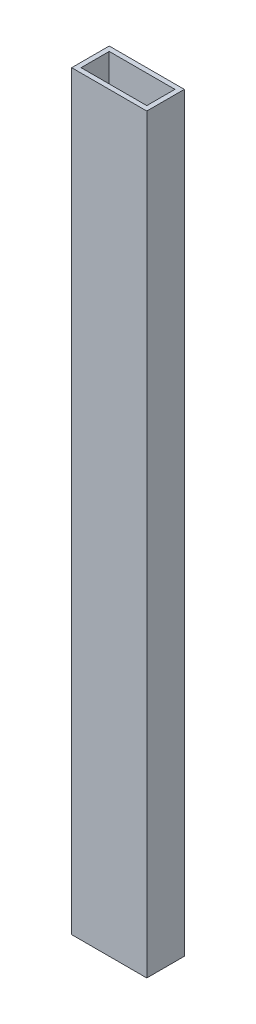
ISO-10303-21;
HEADER;
FILE_DESCRIPTION(('STEP AP214'),'2;1');
FILE_NAME('part.step','',(''),(''),'','','');
FILE_SCHEMA(('AUTOMOTIVE_DESIGN { 1 0 10303 214 1 1 1 1 }'));
ENDSEC;
DATA;
#1=APPLICATION_CONTEXT('core data for automotive mechanical design processes');
#2=APPLICATION_PROTOCOL_DEFINITION('international standard','automotive_design',2000,#1);
#3=PRODUCT_CONTEXT('',#1,'mechanical');
#4=PRODUCT('Part','Part','',(#3));
#5=PRODUCT_RELATED_PRODUCT_CATEGORY('part','',(#4));
#6=PRODUCT_DEFINITION_FORMATION('','',#4);
#7=PRODUCT_DEFINITION_CONTEXT('part definition',#1,'design');
#8=PRODUCT_DEFINITION('design','',#6,#7);
#9=PRODUCT_DEFINITION_SHAPE('','',#8);
#10=(LENGTH_UNIT() NAMED_UNIT(*) SI_UNIT(.MILLI.,.METRE.));
#11=(NAMED_UNIT(*) PLANE_ANGLE_UNIT() SI_UNIT($,.RADIAN.));
#12=(NAMED_UNIT(*) SI_UNIT($,.STERADIAN.) SOLID_ANGLE_UNIT());
#13=UNCERTAINTY_MEASURE_WITH_UNIT(LENGTH_MEASURE(1.E-05),#10,'distance_accuracy_value','');
#14=(GEOMETRIC_REPRESENTATION_CONTEXT(3) GLOBAL_UNCERTAINTY_ASSIGNED_CONTEXT((#13)) GLOBAL_UNIT_ASSIGNED_CONTEXT((#10,
#11,#12)) REPRESENTATION_CONTEXT('',''));
#15=CARTESIAN_POINT('',(0.,0.,0.));
#16=DIRECTION('',(0.,0.,1.));
#17=DIRECTION('',(1.,0.,0.));
#18=AXIS2_PLACEMENT_3D('',#15,#16,#17);
#19=CARTESIAN_POINT('',(0.,254.,0.));
#20=DIRECTION('',(0.,1.,0.));
#21=DIRECTION('',(0.,0.,1.));
#22=AXIS2_PLACEMENT_3D('',#19,#20,#21);
#23=PLANE('',#22);
#24=DIRECTION('',(0.,0.,1.));
#25=VECTOR('',#24,1.);
#26=CARTESIAN_POINT('',(-25.4,254.,12.7));
#27=LINE('',#26,#25);
#28=CARTESIAN_POINT('',(-25.4,254.,-12.7));
#29=VERTEX_POINT('',#28);
#30=CARTESIAN_POINT('',(-25.4,254.,12.7));
#31=VERTEX_POINT('',#30);
#32=EDGE_CURVE('E159',#29,#31,#27,.T.);
#33=ORIENTED_EDGE('',*,*,#32,.T.);
#34=DIRECTION('',(1.,0.,0.));
#35=VECTOR('',#34,1.);
#36=CARTESIAN_POINT('',(25.4,254.,12.7));
#37=LINE('',#36,#35);
#38=CARTESIAN_POINT('',(25.4,254.,12.7));
#39=VERTEX_POINT('',#38);
#40=EDGE_CURVE('E163',#31,#39,#37,.T.);
#41=ORIENTED_EDGE('',*,*,#40,.T.);
#42=DIRECTION('',(0.,0.,-1.));
#43=VECTOR('',#42,1.);
#44=CARTESIAN_POINT('',(25.4,254.,12.7));
#45=LINE('',#44,#43);
#46=CARTESIAN_POINT('',(25.4,254.,-12.7));
#47=VERTEX_POINT('',#46);
#48=EDGE_CURVE('E167',#39,#47,#45,.T.);
#49=ORIENTED_EDGE('',*,*,#48,.T.);
#50=DIRECTION('',(-1.,0.,0.));
#51=VECTOR('',#50,1.);
#52=CARTESIAN_POINT('',(25.4,254.,-12.7));
#53=LINE('',#52,#51);
#54=EDGE_CURVE('E170',#47,#29,#53,.T.);
#55=ORIENTED_EDGE('',*,*,#54,.T.);
#56=EDGE_LOOP('',(#33,#41,#49,#55));
#57=FACE_BOUND('',#56,.T.);
#58=DIRECTION('',(-1.,0.,0.));
#59=VECTOR('',#58,1.);
#60=CARTESIAN_POINT('',(22.225,254.,-9.525));
#61=LINE('',#60,#59);
#62=CARTESIAN_POINT('',(22.225,254.,-9.525));
#63=VERTEX_POINT('',#62);
#64=CARTESIAN_POINT('',(-22.225,254.,-9.525));
#65=VERTEX_POINT('',#64);
#66=EDGE_CURVE('E120',#63,#65,#61,.T.);
#67=ORIENTED_EDGE('',*,*,#66,.F.);
#68=DIRECTION('',(0.,0.,-1.));
#69=VECTOR('',#68,1.);
#70=CARTESIAN_POINT('',(22.225,254.,9.525));
#71=LINE('',#70,#69);
#72=CARTESIAN_POINT('',(22.225,254.,9.525));
#73=VERTEX_POINT('',#72);
#74=EDGE_CURVE('E111',#73,#63,#71,.T.);
#75=ORIENTED_EDGE('',*,*,#74,.F.);
#76=DIRECTION('',(1.,0.,0.));
#77=VECTOR('',#76,1.);
#78=CARTESIAN_POINT('',(22.225,254.,9.525));
#79=LINE('',#78,#77);
#80=CARTESIAN_POINT('',(-22.225,254.,9.525));
#81=VERTEX_POINT('',#80);
#82=EDGE_CURVE('E137',#81,#73,#79,.T.);
#83=ORIENTED_EDGE('',*,*,#82,.F.);
#84=DIRECTION('',(0.,0.,1.));
#85=VECTOR('',#84,1.);
#86=CARTESIAN_POINT('',(-22.225,254.,9.525));
#87=LINE('',#86,#85);
#88=EDGE_CURVE('E133',#65,#81,#87,.T.);
#89=ORIENTED_EDGE('',*,*,#88,.F.);
#90=EDGE_LOOP('',(#67,#75,#83,#89));
#91=FACE_BOUND('',#90,.T.);
#92=ADVANCED_FACE('F45',(#57,#91),#23,.T.);
#93=CARTESIAN_POINT('',(0.,-254.,0.));
#94=DIRECTION('',(0.,1.,0.));
#95=DIRECTION('',(0.,0.,1.));
#96=AXIS2_PLACEMENT_3D('',#93,#94,#95);
#97=PLANE('',#96);
#98=DIRECTION('',(0.,0.,1.));
#99=VECTOR('',#98,1.);
#100=CARTESIAN_POINT('',(-25.4,-254.,12.7));
#101=LINE('',#100,#99);
#102=CARTESIAN_POINT('',(-25.4,-254.,-12.7));
#103=VERTEX_POINT('',#102);
#104=CARTESIAN_POINT('',(-25.4,-254.,12.7));
#105=VERTEX_POINT('',#104);
#106=EDGE_CURVE('E129',#103,#105,#101,.T.);
#107=ORIENTED_EDGE('',*,*,#106,.F.);
#108=DIRECTION('',(-1.,0.,0.));
#109=VECTOR('',#108,1.);
#110=CARTESIAN_POINT('',(25.4,-254.,-12.7));
#111=LINE('',#110,#109);
#112=CARTESIAN_POINT('',(25.4,-254.,-12.7));
#113=VERTEX_POINT('',#112);
#114=EDGE_CURVE('E164',#113,#103,#111,.T.);
#115=ORIENTED_EDGE('',*,*,#114,.F.);
#116=DIRECTION('',(0.,0.,-1.));
#117=VECTOR('',#116,1.);
#118=CARTESIAN_POINT('',(25.4,-254.,12.7));
#119=LINE('',#118,#117);
#120=CARTESIAN_POINT('',(25.4,-254.,12.7));
#121=VERTEX_POINT('',#120);
#122=EDGE_CURVE('E180',#121,#113,#119,.T.);
#123=ORIENTED_EDGE('',*,*,#122,.F.);
#124=DIRECTION('',(1.,0.,0.));
#125=VECTOR('',#124,1.);
#126=CARTESIAN_POINT('',(25.4,-254.,12.7));
#127=LINE('',#126,#125);
#128=EDGE_CURVE('E177',#105,#121,#127,.T.);
#129=ORIENTED_EDGE('',*,*,#128,.F.);
#130=EDGE_LOOP('',(#107,#115,#123,#129));
#131=FACE_BOUND('',#130,.T.);
#132=DIRECTION('',(0.,0.,-1.));
#133=VECTOR('',#132,1.);
#134=CARTESIAN_POINT('',(22.225,-254.,9.525));
#135=LINE('',#134,#133);
#136=CARTESIAN_POINT('',(22.225,-254.,9.525));
#137=VERTEX_POINT('',#136);
#138=CARTESIAN_POINT('',(22.225,-254.,-9.525));
#139=VERTEX_POINT('',#138);
#140=EDGE_CURVE('E69',#137,#139,#135,.T.);
#141=ORIENTED_EDGE('',*,*,#140,.T.);
#142=DIRECTION('',(-1.,0.,0.));
#143=VECTOR('',#142,1.);
#144=CARTESIAN_POINT('',(22.225,-254.,-9.525));
#145=LINE('',#144,#143);
#146=CARTESIAN_POINT('',(-22.225,-254.,-9.525));
#147=VERTEX_POINT('',#146);
#148=EDGE_CURVE('E127',#139,#147,#145,.T.);
#149=ORIENTED_EDGE('',*,*,#148,.T.);
#150=DIRECTION('',(0.,0.,1.));
#151=VECTOR('',#150,1.);
#152=CARTESIAN_POINT('',(-22.225,-254.,9.525));
#153=LINE('',#152,#151);
#154=CARTESIAN_POINT('',(-22.225,-254.,9.525));
#155=VERTEX_POINT('',#154);
#156=EDGE_CURVE('E146',#147,#155,#153,.T.);
#157=ORIENTED_EDGE('',*,*,#156,.T.);
#158=DIRECTION('',(1.,0.,0.));
#159=VECTOR('',#158,1.);
#160=CARTESIAN_POINT('',(22.225,-254.,9.525));
#161=LINE('',#160,#159);
#162=EDGE_CURVE('E121',#155,#137,#161,.T.);
#163=ORIENTED_EDGE('',*,*,#162,.T.);
#164=EDGE_LOOP('',(#141,#149,#157,#163));
#165=FACE_BOUND('',#164,.T.);
#166=ADVANCED_FACE('F203',(#131,#165),#97,.F.);
#167=CARTESIAN_POINT('',(-25.4,254.,12.7));
#168=DIRECTION('',(1.,0.,0.));
#169=DIRECTION('',(0.,0.,-1.));
#170=AXIS2_PLACEMENT_3D('',#167,#168,#169);
#171=PLANE('',#170);
#172=ORIENTED_EDGE('',*,*,#106,.T.);
#173=DIRECTION('',(0.,-1.,0.));
#174=VECTOR('',#173,1.);
#175=CARTESIAN_POINT('',(-25.4,254.,12.7));
#176=LINE('',#175,#174);
#177=EDGE_CURVE('E11',#31,#105,#176,.T.);
#178=ORIENTED_EDGE('',*,*,#177,.F.);
#179=ORIENTED_EDGE('',*,*,#32,.F.);
#180=DIRECTION('',(0.,-1.,0.));
#181=VECTOR('',#180,1.);
#182=CARTESIAN_POINT('',(-25.4,254.,-12.7));
#183=LINE('',#182,#181);
#184=EDGE_CURVE('E173',#29,#103,#183,.T.);
#185=ORIENTED_EDGE('',*,*,#184,.T.);
#186=EDGE_LOOP('',(#172,#178,#179,#185));
#187=FACE_BOUND('',#186,.T.);
#188=ADVANCED_FACE('F47',(#187),#171,.F.);
#189=CARTESIAN_POINT('',(25.4,254.,12.7));
#190=DIRECTION('',(0.,0.,-1.));
#191=DIRECTION('',(-1.,0.,0.));
#192=AXIS2_PLACEMENT_3D('',#189,#190,#191);
#193=PLANE('',#192);
#194=ORIENTED_EDGE('',*,*,#128,.T.);
#195=DIRECTION('',(0.,-1.,0.));
#196=VECTOR('',#195,1.);
#197=CARTESIAN_POINT('',(25.4,254.,12.7));
#198=LINE('',#197,#196);
#199=EDGE_CURVE('E54',#39,#121,#198,.T.);
#200=ORIENTED_EDGE('',*,*,#199,.F.);
#201=ORIENTED_EDGE('',*,*,#40,.F.);
#202=ORIENTED_EDGE('',*,*,#177,.T.);
#203=EDGE_LOOP('',(#194,#200,#201,#202));
#204=FACE_BOUND('',#203,.T.);
#205=ADVANCED_FACE('F213',(#204),#193,.F.);
#206=CARTESIAN_POINT('',(25.4,254.,12.7));
#207=DIRECTION('',(-1.,0.,0.));
#208=DIRECTION('',(0.,0.,1.));
#209=AXIS2_PLACEMENT_3D('',#206,#207,#208);
#210=PLANE('',#209);
#211=ORIENTED_EDGE('',*,*,#122,.T.);
#212=DIRECTION('',(0.,-1.,0.));
#213=VECTOR('',#212,1.);
#214=CARTESIAN_POINT('',(25.4,254.,-12.7));
#215=LINE('',#214,#213);
#216=EDGE_CURVE('E188',#47,#113,#215,.T.);
#217=ORIENTED_EDGE('',*,*,#216,.F.);
#218=ORIENTED_EDGE('',*,*,#48,.F.);
#219=ORIENTED_EDGE('',*,*,#199,.T.);
#220=EDGE_LOOP('',(#211,#217,#218,#219));
#221=FACE_BOUND('',#220,.T.);
#222=ADVANCED_FACE('F197',(#221),#210,.F.);
#223=CARTESIAN_POINT('',(25.4,254.,-12.7));
#224=DIRECTION('',(0.,0.,1.));
#225=DIRECTION('',(1.,0.,0.));
#226=AXIS2_PLACEMENT_3D('',#223,#224,#225);
#227=PLANE('',#226);
#228=ORIENTED_EDGE('',*,*,#114,.T.);
#229=ORIENTED_EDGE('',*,*,#184,.F.);
#230=ORIENTED_EDGE('',*,*,#54,.F.);
#231=ORIENTED_EDGE('',*,*,#216,.T.);
#232=EDGE_LOOP('',(#228,#229,#230,#231));
#233=FACE_BOUND('',#232,.T.);
#234=ADVANCED_FACE('F207',(#233),#227,.F.);
#235=CARTESIAN_POINT('',(22.225,254.,9.525));
#236=DIRECTION('',(-1.,0.,0.));
#237=DIRECTION('',(0.,0.,1.));
#238=AXIS2_PLACEMENT_3D('',#235,#236,#237);
#239=PLANE('',#238);
#240=ORIENTED_EDGE('',*,*,#140,.F.);
#241=DIRECTION('',(0.,-1.,0.));
#242=VECTOR('',#241,1.);
#243=CARTESIAN_POINT('',(22.225,254.,9.525));
#244=LINE('',#243,#242);
#245=EDGE_CURVE('E115',#73,#137,#244,.T.);
#246=ORIENTED_EDGE('',*,*,#245,.F.);
#247=ORIENTED_EDGE('',*,*,#74,.T.);
#248=DIRECTION('',(0.,-1.,0.));
#249=VECTOR('',#248,1.);
#250=CARTESIAN_POINT('',(22.225,254.,-9.525));
#251=LINE('',#250,#249);
#252=EDGE_CURVE('E114',#63,#139,#251,.T.);
#253=ORIENTED_EDGE('',*,*,#252,.T.);
#254=EDGE_LOOP('',(#240,#246,#247,#253));
#255=FACE_BOUND('',#254,.T.);
#256=ADVANCED_FACE('F113',(#255),#239,.T.);
#257=CARTESIAN_POINT('',(22.225,254.,-9.525));
#258=DIRECTION('',(0.,0.,1.));
#259=DIRECTION('',(1.,0.,0.));
#260=AXIS2_PLACEMENT_3D('',#257,#258,#259);
#261=PLANE('',#260);
#262=ORIENTED_EDGE('',*,*,#148,.F.);
#263=ORIENTED_EDGE('',*,*,#252,.F.);
#264=ORIENTED_EDGE('',*,*,#66,.T.);
#265=DIRECTION('',(0.,-1.,0.));
#266=VECTOR('',#265,1.);
#267=CARTESIAN_POINT('',(-22.225,254.,-9.525));
#268=LINE('',#267,#266);
#269=EDGE_CURVE('E130',#65,#147,#268,.T.);
#270=ORIENTED_EDGE('',*,*,#269,.T.);
#271=EDGE_LOOP('',(#262,#263,#264,#270));
#272=FACE_BOUND('',#271,.T.);
#273=ADVANCED_FACE('F124',(#272),#261,.T.);
#274=CARTESIAN_POINT('',(-22.225,254.,9.525));
#275=DIRECTION('',(1.,0.,0.));
#276=DIRECTION('',(0.,0.,-1.));
#277=AXIS2_PLACEMENT_3D('',#274,#275,#276);
#278=PLANE('',#277);
#279=ORIENTED_EDGE('',*,*,#156,.F.);
#280=ORIENTED_EDGE('',*,*,#269,.F.);
#281=ORIENTED_EDGE('',*,*,#88,.T.);
#282=DIRECTION('',(0.,-1.,0.));
#283=VECTOR('',#282,1.);
#284=CARTESIAN_POINT('',(-22.225,254.,9.525));
#285=LINE('',#284,#283);
#286=EDGE_CURVE('E61',#81,#155,#285,.T.);
#287=ORIENTED_EDGE('',*,*,#286,.T.);
#288=EDGE_LOOP('',(#279,#280,#281,#287));
#289=FACE_BOUND('',#288,.T.);
#290=ADVANCED_FACE('F236',(#289),#278,.T.);
#291=CARTESIAN_POINT('',(22.225,254.,9.525));
#292=DIRECTION('',(0.,0.,-1.));
#293=DIRECTION('',(-1.,0.,0.));
#294=AXIS2_PLACEMENT_3D('',#291,#292,#293);
#295=PLANE('',#294);
#296=ORIENTED_EDGE('',*,*,#162,.F.);
#297=ORIENTED_EDGE('',*,*,#286,.F.);
#298=ORIENTED_EDGE('',*,*,#82,.T.);
#299=ORIENTED_EDGE('',*,*,#245,.T.);
#300=EDGE_LOOP('',(#296,#297,#298,#299));
#301=FACE_BOUND('',#300,.T.);
#302=ADVANCED_FACE('F240',(#301),#295,.T.);
#303=CLOSED_SHELL('',(#92,#166,#188,#205,#222,#234,#256,#273,#290,#302));
#304=MANIFOLD_SOLID_BREP('B2',#303);
#305=ADVANCED_BREP_SHAPE_REPRESENTATION('',(#18,#304),#14);
#306=SHAPE_DEFINITION_REPRESENTATION(#9,#305);
ENDSEC;
END-ISO-10303-21;
